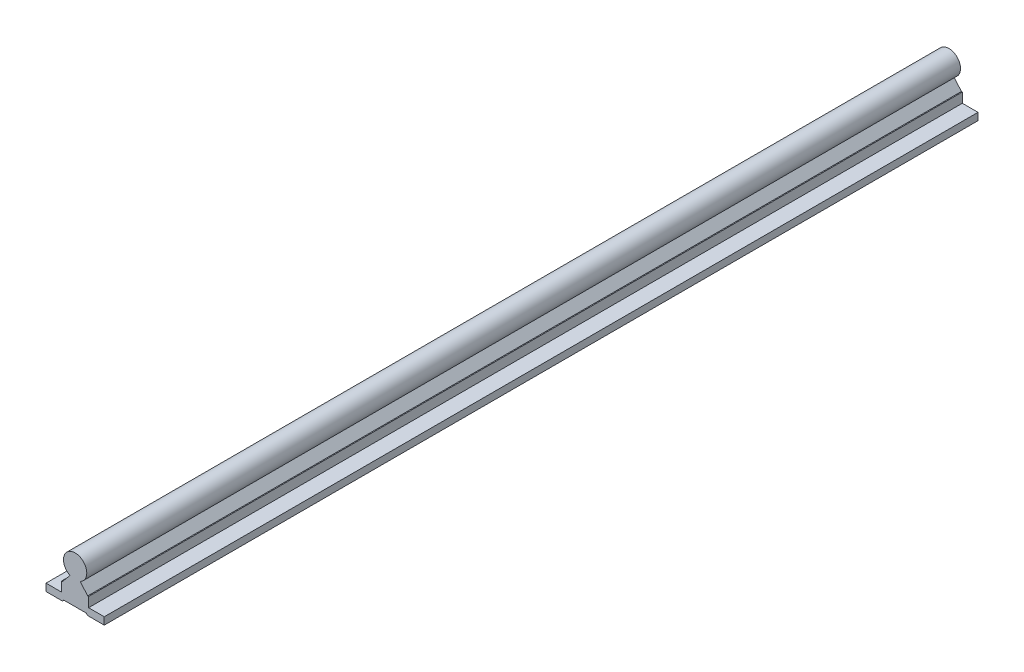
ISO-10303-21;
HEADER;
FILE_DESCRIPTION(('STEP AP214'),'2;1');
FILE_NAME('part.step','',(''),(''),'','','');
FILE_SCHEMA(('AUTOMOTIVE_DESIGN { 1 0 10303 214 1 1 1 1 }'));
ENDSEC;
DATA;
#1=APPLICATION_CONTEXT('core data for automotive mechanical design processes');
#2=APPLICATION_PROTOCOL_DEFINITION('international standard','automotive_design',2000,#1);
#3=PRODUCT_CONTEXT('',#1,'mechanical');
#4=PRODUCT('Part','Part','',(#3));
#5=PRODUCT_RELATED_PRODUCT_CATEGORY('part','',(#4));
#6=PRODUCT_DEFINITION_FORMATION('','',#4);
#7=PRODUCT_DEFINITION_CONTEXT('part definition',#1,'design');
#8=PRODUCT_DEFINITION('design','',#6,#7);
#9=PRODUCT_DEFINITION_SHAPE('','',#8);
#10=(LENGTH_UNIT() NAMED_UNIT(*) SI_UNIT(.MILLI.,.METRE.));
#11=(NAMED_UNIT(*) PLANE_ANGLE_UNIT() SI_UNIT($,.RADIAN.));
#12=(NAMED_UNIT(*) SI_UNIT($,.STERADIAN.) SOLID_ANGLE_UNIT());
#13=UNCERTAINTY_MEASURE_WITH_UNIT(LENGTH_MEASURE(1.E-05),#10,'distance_accuracy_value','');
#14=(GEOMETRIC_REPRESENTATION_CONTEXT(3) GLOBAL_UNCERTAINTY_ASSIGNED_CONTEXT((#13)) GLOBAL_UNIT_ASSIGNED_CONTEXT((#10,
#11,#12)) REPRESENTATION_CONTEXT('',''));
#15=CARTESIAN_POINT('',(0.,0.,0.));
#16=DIRECTION('',(0.,0.,1.));
#17=DIRECTION('',(1.,0.,0.));
#18=AXIS2_PLACEMENT_3D('',#15,#16,#17);
#19=CARTESIAN_POINT('',(0.,25.,600.));
#20=DIRECTION('',(0.,0.,-1.));
#21=DIRECTION('',(-1.,0.,0.));
#22=AXIS2_PLACEMENT_3D('',#19,#20,#21);
#23=CYLINDRICAL_SURFACE('',#22,8.);
#24=CARTESIAN_POINT('',(0.,25.,0.));
#25=DIRECTION('',(0.,0.,1.));
#26=DIRECTION('',(1.,0.,0.));
#27=AXIS2_PLACEMENT_3D('',#24,#25,#26);
#28=CIRCLE('',#27,8.);
#29=CARTESIAN_POINT('',(3.48711915483254,17.8,0.));
#30=VERTEX_POINT('',#29);
#31=CARTESIAN_POINT('',(-3.48711915483254,17.8,0.));
#32=VERTEX_POINT('',#31);
#33=EDGE_CURVE('E178',#30,#32,#28,.T.);
#34=ORIENTED_EDGE('',*,*,#33,.T.);
#35=DIRECTION('',(0.,0.,-1.));
#36=VECTOR('',#35,1.);
#37=CARTESIAN_POINT('',(-3.48711915483254,17.8,600.));
#38=LINE('',#37,#36);
#39=CARTESIAN_POINT('',(-3.48711915483254,17.8,600.));
#40=VERTEX_POINT('',#39);
#41=EDGE_CURVE('E11',#40,#32,#38,.T.);
#42=ORIENTED_EDGE('',*,*,#41,.F.);
#43=CARTESIAN_POINT('',(0.,25.,600.));
#44=DIRECTION('',(0.,0.,1.));
#45=DIRECTION('',(1.,0.,0.));
#46=AXIS2_PLACEMENT_3D('',#43,#44,#45);
#47=CIRCLE('',#46,8.);
#48=CARTESIAN_POINT('',(3.48711915483254,17.8,600.));
#49=VERTEX_POINT('',#48);
#50=EDGE_CURVE('E208',#49,#40,#47,.T.);
#51=ORIENTED_EDGE('',*,*,#50,.F.);
#52=DIRECTION('',(0.,0.,-1.));
#53=VECTOR('',#52,1.);
#54=CARTESIAN_POINT('',(3.48711915483254,17.8,600.));
#55=LINE('',#54,#53);
#56=EDGE_CURVE('E174',#49,#30,#55,.T.);
#57=ORIENTED_EDGE('',*,*,#56,.T.);
#58=EDGE_LOOP('',(#34,#42,#51,#57));
#59=FACE_BOUND('',#58,.T.);
#60=ADVANCED_FACE('F34',(#59),#23,.T.);
#61=CARTESIAN_POINT('',(-3.48711915483254,17.8,600.));
#62=DIRECTION('',(0.766044443118977,-0.64278760968654,0.));
#63=DIRECTION('',(0.642787609686541,0.766044443118977,0.));
#64=AXIS2_PLACEMENT_3D('',#61,#62,#63);
#65=PLANE('',#64);
#66=DIRECTION('',(-0.64278760968654,-0.766044443118977,0.));
#67=VECTOR('',#66,1.);
#68=CARTESIAN_POINT('',(-3.48711915483254,17.8,0.));
#69=LINE('',#68,#67);
#70=CARTESIAN_POINT('',(-8.60562690501396,11.7,0.));
#71=VERTEX_POINT('',#70);
#72=EDGE_CURVE('E181',#32,#71,#69,.T.);
#73=ORIENTED_EDGE('',*,*,#72,.T.);
#74=DIRECTION('',(0.,0.,-1.));
#75=VECTOR('',#74,1.);
#76=CARTESIAN_POINT('',(-8.60562690501396,11.7,600.));
#77=LINE('',#76,#75);
#78=CARTESIAN_POINT('',(-8.60562690501396,11.7,600.));
#79=VERTEX_POINT('',#78);
#80=EDGE_CURVE('E42',#79,#71,#77,.T.);
#81=ORIENTED_EDGE('',*,*,#80,.F.);
#82=DIRECTION('',(-0.64278760968654,-0.766044443118977,0.));
#83=VECTOR('',#82,1.);
#84=CARTESIAN_POINT('',(-3.48711915483254,17.8,600.));
#85=LINE('',#84,#83);
#86=EDGE_CURVE('E117',#40,#79,#85,.T.);
#87=ORIENTED_EDGE('',*,*,#86,.F.);
#88=ORIENTED_EDGE('',*,*,#41,.T.);
#89=EDGE_LOOP('',(#73,#81,#87,#88));
#90=FACE_BOUND('',#89,.T.);
#91=ADVANCED_FACE('F306',(#90),#65,.F.);
#92=CARTESIAN_POINT('',(-8.60562690501396,11.7,600.));
#93=DIRECTION('',(0.,-1.,0.));
#94=DIRECTION('',(0.,0.,-1.));
#95=AXIS2_PLACEMENT_3D('',#92,#93,#94);
#96=PLANE('',#95);
#97=DIRECTION('',(-1.,0.,0.));
#98=VECTOR('',#97,1.);
#99=CARTESIAN_POINT('',(-8.60562690501396,11.7,0.));
#100=LINE('',#99,#98);
#101=CARTESIAN_POINT('',(-9.25,11.7,0.));
#102=VERTEX_POINT('',#101);
#103=EDGE_CURVE('E183',#71,#102,#100,.T.);
#104=ORIENTED_EDGE('',*,*,#103,.T.);
#105=DIRECTION('',(0.,0.,-1.));
#106=VECTOR('',#105,1.);
#107=CARTESIAN_POINT('',(-9.25,11.7,600.));
#108=LINE('',#107,#106);
#109=CARTESIAN_POINT('',(-9.25,11.7,600.));
#110=VERTEX_POINT('',#109);
#111=EDGE_CURVE('E239',#110,#102,#108,.T.);
#112=ORIENTED_EDGE('',*,*,#111,.F.);
#113=DIRECTION('',(-1.,0.,0.));
#114=VECTOR('',#113,1.);
#115=CARTESIAN_POINT('',(-8.60562690501396,11.7,600.));
#116=LINE('',#115,#114);
#117=EDGE_CURVE('E247',#79,#110,#116,.T.);
#118=ORIENTED_EDGE('',*,*,#117,.F.);
#119=ORIENTED_EDGE('',*,*,#80,.T.);
#120=EDGE_LOOP('',(#104,#112,#118,#119));
#121=FACE_BOUND('',#120,.T.);
#122=ADVANCED_FACE('F245',(#121),#96,.F.);
#123=CARTESIAN_POINT('',(-9.25,11.7,600.));
#124=DIRECTION('',(1.,0.,0.));
#125=DIRECTION('',(0.,0.,-1.));
#126=AXIS2_PLACEMENT_3D('',#123,#124,#125);
#127=PLANE('',#126);
#128=DIRECTION('',(0.,-1.,0.));
#129=VECTOR('',#128,1.);
#130=CARTESIAN_POINT('',(-9.25,11.7,0.));
#131=LINE('',#130,#129);
#132=CARTESIAN_POINT('',(-9.25,5.,0.));
#133=VERTEX_POINT('',#132);
#134=EDGE_CURVE('E185',#102,#133,#131,.T.);
#135=ORIENTED_EDGE('',*,*,#134,.T.);
#136=DIRECTION('',(0.,0.,-1.));
#137=VECTOR('',#136,1.);
#138=CARTESIAN_POINT('',(-9.25,5.,600.));
#139=LINE('',#138,#137);
#140=CARTESIAN_POINT('',(-9.25,5.,600.));
#141=VERTEX_POINT('',#140);
#142=EDGE_CURVE('E236',#141,#133,#139,.T.);
#143=ORIENTED_EDGE('',*,*,#142,.F.);
#144=DIRECTION('',(0.,-1.,0.));
#145=VECTOR('',#144,1.);
#146=CARTESIAN_POINT('',(-9.25,11.7,600.));
#147=LINE('',#146,#145);
#148=EDGE_CURVE('E265',#110,#141,#147,.T.);
#149=ORIENTED_EDGE('',*,*,#148,.F.);
#150=ORIENTED_EDGE('',*,*,#111,.T.);
#151=EDGE_LOOP('',(#135,#143,#149,#150));
#152=FACE_BOUND('',#151,.T.);
#153=ADVANCED_FACE('F256',(#152),#127,.F.);
#154=CARTESIAN_POINT('',(-9.25,5.,600.));
#155=DIRECTION('',(0.,-1.,0.));
#156=DIRECTION('',(1.,0.,0.));
#157=AXIS2_PLACEMENT_3D('',#154,#155,#156);
#158=PLANE('',#157);
#159=DIRECTION('',(-1.,0.,0.));
#160=VECTOR('',#159,1.);
#161=CARTESIAN_POINT('',(-9.25,5.,0.));
#162=LINE('',#161,#160);
#163=CARTESIAN_POINT('',(-20.,5.,0.));
#164=VERTEX_POINT('',#163);
#165=EDGE_CURVE('E187',#133,#164,#162,.T.);
#166=ORIENTED_EDGE('',*,*,#165,.T.);
#167=DIRECTION('',(0.,0.,-1.));
#168=VECTOR('',#167,1.);
#169=CARTESIAN_POINT('',(-20.,5.,600.));
#170=LINE('',#169,#168);
#171=CARTESIAN_POINT('',(-20.,5.,600.));
#172=VERTEX_POINT('',#171);
#173=EDGE_CURVE('E233',#172,#164,#170,.T.);
#174=ORIENTED_EDGE('',*,*,#173,.F.);
#175=DIRECTION('',(-1.,0.,0.));
#176=VECTOR('',#175,1.);
#177=CARTESIAN_POINT('',(-9.25,5.,600.));
#178=LINE('',#177,#176);
#179=EDGE_CURVE('E262',#141,#172,#178,.T.);
#180=ORIENTED_EDGE('',*,*,#179,.F.);
#181=ORIENTED_EDGE('',*,*,#142,.T.);
#182=EDGE_LOOP('',(#166,#174,#180,#181));
#183=FACE_BOUND('',#182,.T.);
#184=ADVANCED_FACE('F260',(#183),#158,.F.);
#185=CARTESIAN_POINT('',(-20.,5.,600.));
#186=DIRECTION('',(1.,0.,0.));
#187=DIRECTION('',(0.,1.,0.));
#188=AXIS2_PLACEMENT_3D('',#185,#186,#187);
#189=PLANE('',#188);
#190=DIRECTION('',(0.,-1.,0.));
#191=VECTOR('',#190,1.);
#192=CARTESIAN_POINT('',(-20.,5.,0.));
#193=LINE('',#192,#191);
#194=CARTESIAN_POINT('',(-20.,0.,0.));
#195=VERTEX_POINT('',#194);
#196=EDGE_CURVE('E189',#164,#195,#193,.T.);
#197=ORIENTED_EDGE('',*,*,#196,.T.);
#198=DIRECTION('',(0.,0.,-1.));
#199=VECTOR('',#198,1.);
#200=CARTESIAN_POINT('',(-20.,0.,600.));
#201=LINE('',#200,#199);
#202=CARTESIAN_POINT('',(-20.,0.,600.));
#203=VERTEX_POINT('',#202);
#204=EDGE_CURVE('E230',#203,#195,#201,.T.);
#205=ORIENTED_EDGE('',*,*,#204,.F.);
#206=DIRECTION('',(0.,-1.,0.));
#207=VECTOR('',#206,1.);
#208=CARTESIAN_POINT('',(-20.,5.,600.));
#209=LINE('',#208,#207);
#210=EDGE_CURVE('E264',#172,#203,#209,.T.);
#211=ORIENTED_EDGE('',*,*,#210,.F.);
#212=ORIENTED_EDGE('',*,*,#173,.T.);
#213=EDGE_LOOP('',(#197,#205,#211,#212));
#214=FACE_BOUND('',#213,.T.);
#215=ADVANCED_FACE('F319',(#214),#189,.F.);
#216=CARTESIAN_POINT('',(-20.,0.,600.));
#217=DIRECTION('',(0.,1.,0.));
#218=DIRECTION('',(-1.,0.,0.));
#219=AXIS2_PLACEMENT_3D('',#216,#217,#218);
#220=PLANE('',#219);
#221=DIRECTION('',(1.,0.,0.));
#222=VECTOR('',#221,1.);
#223=CARTESIAN_POINT('',(-20.,0.,0.));
#224=LINE('',#223,#222);
#225=CARTESIAN_POINT('',(-8.60562690501397,0.,0.));
#226=VERTEX_POINT('',#225);
#227=EDGE_CURVE('E191',#195,#226,#224,.T.);
#228=ORIENTED_EDGE('',*,*,#227,.T.);
#229=DIRECTION('',(0.,0.,-1.));
#230=VECTOR('',#229,1.);
#231=CARTESIAN_POINT('',(-8.60562690501397,0.,600.));
#232=LINE('',#231,#230);
#233=CARTESIAN_POINT('',(-8.60562690501397,0.,600.));
#234=VERTEX_POINT('',#233);
#235=EDGE_CURVE('E227',#234,#226,#232,.T.);
#236=ORIENTED_EDGE('',*,*,#235,.F.);
#237=DIRECTION('',(1.,0.,0.));
#238=VECTOR('',#237,1.);
#239=CARTESIAN_POINT('',(-20.,0.,600.));
#240=LINE('',#239,#238);
#241=EDGE_CURVE('E267',#203,#234,#240,.T.);
#242=ORIENTED_EDGE('',*,*,#241,.F.);
#243=ORIENTED_EDGE('',*,*,#204,.T.);
#244=EDGE_LOOP('',(#228,#236,#242,#243));
#245=FACE_BOUND('',#244,.T.);
#246=ADVANCED_FACE('F322',(#245),#220,.F.);
#247=CARTESIAN_POINT('',(-8.60562690501397,0.,600.));
#248=DIRECTION('',(-0.766044443118977,0.642787609686541,0.));
#249=DIRECTION('',(-0.642787609686541,-0.766044443118977,0.));
#250=AXIS2_PLACEMENT_3D('',#247,#248,#249);
#251=PLANE('',#250);
#252=DIRECTION('',(0.642787609686541,0.766044443118977,0.));
#253=VECTOR('',#252,1.);
#254=CARTESIAN_POINT('',(-8.60562690501397,0.,0.));
#255=LINE('',#254,#253);
#256=CARTESIAN_POINT('',(-7.76652727383668,1.00000000000001,0.));
#257=VERTEX_POINT('',#256);
#258=EDGE_CURVE('E193',#226,#257,#255,.T.);
#259=ORIENTED_EDGE('',*,*,#258,.T.);
#260=DIRECTION('',(0.,0.,-1.));
#261=VECTOR('',#260,1.);
#262=CARTESIAN_POINT('',(-7.76652727383668,1.00000000000001,600.));
#263=LINE('',#262,#261);
#264=CARTESIAN_POINT('',(-7.76652727383668,1.00000000000001,600.));
#265=VERTEX_POINT('',#264);
#266=EDGE_CURVE('E224',#265,#257,#263,.T.);
#267=ORIENTED_EDGE('',*,*,#266,.F.);
#268=DIRECTION('',(0.642787609686541,0.766044443118977,0.));
#269=VECTOR('',#268,1.);
#270=CARTESIAN_POINT('',(-8.60562690501397,0.,600.));
#271=LINE('',#270,#269);
#272=EDGE_CURVE('E273',#234,#265,#271,.T.);
#273=ORIENTED_EDGE('',*,*,#272,.F.);
#274=ORIENTED_EDGE('',*,*,#235,.T.);
#275=EDGE_LOOP('',(#259,#267,#273,#274));
#276=FACE_BOUND('',#275,.T.);
#277=ADVANCED_FACE('F326',(#276),#251,.F.);
#278=CARTESIAN_POINT('',(-7.76652727383668,1.00000000000001,600.));
#279=DIRECTION('',(0.,1.,0.));
#280=DIRECTION('',(0.,0.,1.));
#281=AXIS2_PLACEMENT_3D('',#278,#279,#280);
#282=PLANE('',#281);
#283=DIRECTION('',(1.,0.,0.));
#284=VECTOR('',#283,1.);
#285=CARTESIAN_POINT('',(-7.76652727383668,1.00000000000001,0.));
#286=LINE('',#285,#284);
#287=CARTESIAN_POINT('',(7.76652727383668,1.00000000000001,0.));
#288=VERTEX_POINT('',#287);
#289=EDGE_CURVE('E195',#257,#288,#286,.T.);
#290=ORIENTED_EDGE('',*,*,#289,.T.);
#291=DIRECTION('',(0.,0.,-1.));
#292=VECTOR('',#291,1.);
#293=CARTESIAN_POINT('',(7.76652727383668,1.00000000000001,600.));
#294=LINE('',#293,#292);
#295=CARTESIAN_POINT('',(7.76652727383668,1.00000000000001,600.));
#296=VERTEX_POINT('',#295);
#297=EDGE_CURVE('E221',#296,#288,#294,.T.);
#298=ORIENTED_EDGE('',*,*,#297,.F.);
#299=DIRECTION('',(1.,0.,0.));
#300=VECTOR('',#299,1.);
#301=CARTESIAN_POINT('',(-7.76652727383668,1.00000000000001,600.));
#302=LINE('',#301,#300);
#303=EDGE_CURVE('E275',#265,#296,#302,.T.);
#304=ORIENTED_EDGE('',*,*,#303,.F.);
#305=ORIENTED_EDGE('',*,*,#266,.T.);
#306=EDGE_LOOP('',(#290,#298,#304,#305));
#307=FACE_BOUND('',#306,.T.);
#308=ADVANCED_FACE('F330',(#307),#282,.F.);
#309=CARTESIAN_POINT('',(8.60562690501397,0.,600.));
#310=DIRECTION('',(0.766044443118977,0.642787609686541,0.));
#311=DIRECTION('',(-0.642787609686541,0.766044443118977,0.));
#312=AXIS2_PLACEMENT_3D('',#309,#310,#311);
#313=PLANE('',#312);
#314=DIRECTION('',(0.642787609686541,-0.766044443118977,0.));
#315=VECTOR('',#314,1.);
#316=CARTESIAN_POINT('',(8.60562690501397,0.,0.));
#317=LINE('',#316,#315);
#318=CARTESIAN_POINT('',(8.60562690501397,0.,0.));
#319=VERTEX_POINT('',#318);
#320=EDGE_CURVE('E197',#288,#319,#317,.T.);
#321=ORIENTED_EDGE('',*,*,#320,.T.);
#322=DIRECTION('',(0.,0.,-1.));
#323=VECTOR('',#322,1.);
#324=CARTESIAN_POINT('',(8.60562690501397,0.,600.));
#325=LINE('',#324,#323);
#326=CARTESIAN_POINT('',(8.60562690501397,0.,600.));
#327=VERTEX_POINT('',#326);
#328=EDGE_CURVE('E218',#327,#319,#325,.T.);
#329=ORIENTED_EDGE('',*,*,#328,.F.);
#330=DIRECTION('',(0.642787609686541,-0.766044443118977,0.));
#331=VECTOR('',#330,1.);
#332=CARTESIAN_POINT('',(8.60562690501397,0.,600.));
#333=LINE('',#332,#331);
#334=EDGE_CURVE('E277',#296,#327,#333,.T.);
#335=ORIENTED_EDGE('',*,*,#334,.F.);
#336=ORIENTED_EDGE('',*,*,#297,.T.);
#337=EDGE_LOOP('',(#321,#329,#335,#336));
#338=FACE_BOUND('',#337,.T.);
#339=ADVANCED_FACE('F334',(#338),#313,.F.);
#340=CARTESIAN_POINT('',(20.,0.,600.));
#341=DIRECTION('',(0.,1.,0.));
#342=DIRECTION('',(-1.,0.,0.));
#343=AXIS2_PLACEMENT_3D('',#340,#341,#342);
#344=PLANE('',#343);
#345=DIRECTION('',(1.,0.,0.));
#346=VECTOR('',#345,1.);
#347=CARTESIAN_POINT('',(20.,0.,0.));
#348=LINE('',#347,#346);
#349=CARTESIAN_POINT('',(20.,0.,0.));
#350=VERTEX_POINT('',#349);
#351=EDGE_CURVE('E199',#319,#350,#348,.T.);
#352=ORIENTED_EDGE('',*,*,#351,.T.);
#353=DIRECTION('',(0.,0.,-1.));
#354=VECTOR('',#353,1.);
#355=CARTESIAN_POINT('',(20.,0.,600.));
#356=LINE('',#355,#354);
#357=CARTESIAN_POINT('',(20.,0.,600.));
#358=VERTEX_POINT('',#357);
#359=EDGE_CURVE('E215',#358,#350,#356,.T.);
#360=ORIENTED_EDGE('',*,*,#359,.F.);
#361=DIRECTION('',(1.,0.,0.));
#362=VECTOR('',#361,1.);
#363=CARTESIAN_POINT('',(20.,0.,600.));
#364=LINE('',#363,#362);
#365=EDGE_CURVE('E279',#327,#358,#364,.T.);
#366=ORIENTED_EDGE('',*,*,#365,.F.);
#367=ORIENTED_EDGE('',*,*,#328,.T.);
#368=EDGE_LOOP('',(#352,#360,#366,#367));
#369=FACE_BOUND('',#368,.T.);
#370=ADVANCED_FACE('F338',(#369),#344,.F.);
#371=CARTESIAN_POINT('',(20.,5.,600.));
#372=DIRECTION('',(-1.,0.,0.));
#373=DIRECTION('',(0.,-1.,0.));
#374=AXIS2_PLACEMENT_3D('',#371,#372,#373);
#375=PLANE('',#374);
#376=DIRECTION('',(0.,1.,0.));
#377=VECTOR('',#376,1.);
#378=CARTESIAN_POINT('',(20.,5.,0.));
#379=LINE('',#378,#377);
#380=CARTESIAN_POINT('',(20.,5.,0.));
#381=VERTEX_POINT('',#380);
#382=EDGE_CURVE('E201',#350,#381,#379,.T.);
#383=ORIENTED_EDGE('',*,*,#382,.T.);
#384=DIRECTION('',(0.,0.,-1.));
#385=VECTOR('',#384,1.);
#386=CARTESIAN_POINT('',(20.,5.,600.));
#387=LINE('',#386,#385);
#388=CARTESIAN_POINT('',(20.,5.,600.));
#389=VERTEX_POINT('',#388);
#390=EDGE_CURVE('E212',#389,#381,#387,.T.);
#391=ORIENTED_EDGE('',*,*,#390,.F.);
#392=DIRECTION('',(0.,1.,0.));
#393=VECTOR('',#392,1.);
#394=CARTESIAN_POINT('',(20.,5.,600.));
#395=LINE('',#394,#393);
#396=EDGE_CURVE('E281',#358,#389,#395,.T.);
#397=ORIENTED_EDGE('',*,*,#396,.F.);
#398=ORIENTED_EDGE('',*,*,#359,.T.);
#399=EDGE_LOOP('',(#383,#391,#397,#398));
#400=FACE_BOUND('',#399,.T.);
#401=ADVANCED_FACE('F287',(#400),#375,.F.);
#402=CARTESIAN_POINT('',(9.25,5.,600.));
#403=DIRECTION('',(0.,-1.,0.));
#404=DIRECTION('',(1.,0.,0.));
#405=AXIS2_PLACEMENT_3D('',#402,#403,#404);
#406=PLANE('',#405);
#407=DIRECTION('',(-1.,0.,0.));
#408=VECTOR('',#407,1.);
#409=CARTESIAN_POINT('',(9.25,5.,0.));
#410=LINE('',#409,#408);
#411=CARTESIAN_POINT('',(9.25,5.,0.));
#412=VERTEX_POINT('',#411);
#413=EDGE_CURVE('E203',#381,#412,#410,.T.);
#414=ORIENTED_EDGE('',*,*,#413,.T.);
#415=DIRECTION('',(0.,0.,-1.));
#416=VECTOR('',#415,1.);
#417=CARTESIAN_POINT('',(9.25,5.,600.));
#418=LINE('',#417,#416);
#419=CARTESIAN_POINT('',(9.25,5.,600.));
#420=VERTEX_POINT('',#419);
#421=EDGE_CURVE('E169',#420,#412,#418,.T.);
#422=ORIENTED_EDGE('',*,*,#421,.F.);
#423=DIRECTION('',(-1.,0.,0.));
#424=VECTOR('',#423,1.);
#425=CARTESIAN_POINT('',(9.25,5.,600.));
#426=LINE('',#425,#424);
#427=EDGE_CURVE('E160',#389,#420,#426,.T.);
#428=ORIENTED_EDGE('',*,*,#427,.F.);
#429=ORIENTED_EDGE('',*,*,#390,.T.);
#430=EDGE_LOOP('',(#414,#422,#428,#429));
#431=FACE_BOUND('',#430,.T.);
#432=ADVANCED_FACE('F291',(#431),#406,.F.);
#433=CARTESIAN_POINT('',(9.25,11.7,600.));
#434=DIRECTION('',(-1.,0.,0.));
#435=DIRECTION('',(0.,0.,1.));
#436=AXIS2_PLACEMENT_3D('',#433,#434,#435);
#437=PLANE('',#436);
#438=DIRECTION('',(0.,1.,0.));
#439=VECTOR('',#438,1.);
#440=CARTESIAN_POINT('',(9.25,11.7,0.));
#441=LINE('',#440,#439);
#442=CARTESIAN_POINT('',(9.25,11.7,0.));
#443=VERTEX_POINT('',#442);
#444=EDGE_CURVE('E168',#412,#443,#441,.T.);
#445=ORIENTED_EDGE('',*,*,#444,.T.);
#446=DIRECTION('',(0.,0.,-1.));
#447=VECTOR('',#446,1.);
#448=CARTESIAN_POINT('',(9.25,11.7,600.));
#449=LINE('',#448,#447);
#450=CARTESIAN_POINT('',(9.25,11.7,600.));
#451=VERTEX_POINT('',#450);
#452=EDGE_CURVE('E165',#451,#443,#449,.T.);
#453=ORIENTED_EDGE('',*,*,#452,.F.);
#454=DIRECTION('',(0.,1.,0.));
#455=VECTOR('',#454,1.);
#456=CARTESIAN_POINT('',(9.25,11.7,600.));
#457=LINE('',#456,#455);
#458=EDGE_CURVE('E154',#420,#451,#457,.T.);
#459=ORIENTED_EDGE('',*,*,#458,.F.);
#460=ORIENTED_EDGE('',*,*,#421,.T.);
#461=EDGE_LOOP('',(#445,#453,#459,#460));
#462=FACE_BOUND('',#461,.T.);
#463=ADVANCED_FACE('F166',(#462),#437,.F.);
#464=CARTESIAN_POINT('',(8.60562690501396,11.7,600.));
#465=DIRECTION('',(0.,-1.,0.));
#466=DIRECTION('',(0.,0.,-1.));
#467=AXIS2_PLACEMENT_3D('',#464,#465,#466);
#468=PLANE('',#467);
#469=DIRECTION('',(-1.,0.,0.));
#470=VECTOR('',#469,1.);
#471=CARTESIAN_POINT('',(8.60562690501396,11.7,0.));
#472=LINE('',#471,#470);
#473=CARTESIAN_POINT('',(8.60562690501396,11.7,0.));
#474=VERTEX_POINT('',#473);
#475=EDGE_CURVE('E103',#443,#474,#472,.T.);
#476=ORIENTED_EDGE('',*,*,#475,.T.);
#477=DIRECTION('',(0.,0.,-1.));
#478=VECTOR('',#477,1.);
#479=CARTESIAN_POINT('',(8.60562690501396,11.7,600.));
#480=LINE('',#479,#478);
#481=CARTESIAN_POINT('',(8.60562690501396,11.7,600.));
#482=VERTEX_POINT('',#481);
#483=EDGE_CURVE('E170',#482,#474,#480,.T.);
#484=ORIENTED_EDGE('',*,*,#483,.F.);
#485=DIRECTION('',(-1.,0.,0.));
#486=VECTOR('',#485,1.);
#487=CARTESIAN_POINT('',(8.60562690501396,11.7,600.));
#488=LINE('',#487,#486);
#489=EDGE_CURVE('E158',#451,#482,#488,.T.);
#490=ORIENTED_EDGE('',*,*,#489,.F.);
#491=ORIENTED_EDGE('',*,*,#452,.T.);
#492=EDGE_LOOP('',(#476,#484,#490,#491));
#493=FACE_BOUND('',#492,.T.);
#494=ADVANCED_FACE('F172',(#493),#468,.F.);
#495=CARTESIAN_POINT('',(3.48711915483254,17.8,600.));
#496=DIRECTION('',(-0.766044443118977,-0.64278760968654,0.));
#497=DIRECTION('',(0.642787609686541,-0.766044443118977,0.));
#498=AXIS2_PLACEMENT_3D('',#495,#496,#497);
#499=PLANE('',#498);
#500=DIRECTION('',(-0.64278760968654,0.766044443118977,0.));
#501=VECTOR('',#500,1.);
#502=CARTESIAN_POINT('',(3.48711915483254,17.8,0.));
#503=LINE('',#502,#501);
#504=EDGE_CURVE('E109',#474,#30,#503,.T.);
#505=ORIENTED_EDGE('',*,*,#504,.T.);
#506=ORIENTED_EDGE('',*,*,#56,.F.);
#507=DIRECTION('',(-0.64278760968654,0.766044443118977,0.));
#508=VECTOR('',#507,1.);
#509=CARTESIAN_POINT('',(3.48711915483254,17.8,600.));
#510=LINE('',#509,#508);
#511=EDGE_CURVE('E50',#482,#49,#510,.T.);
#512=ORIENTED_EDGE('',*,*,#511,.F.);
#513=ORIENTED_EDGE('',*,*,#483,.T.);
#514=EDGE_LOOP('',(#505,#506,#512,#513));
#515=FACE_BOUND('',#514,.T.);
#516=ADVANCED_FACE('F295',(#515),#499,.F.);
#517=CARTESIAN_POINT('',(0.,25.,600.));
#518=DIRECTION('',(0.,0.,1.));
#519=DIRECTION('',(1.,0.,0.));
#520=AXIS2_PLACEMENT_3D('',#517,#518,#519);
#521=PLANE('',#520);
#522=ORIENTED_EDGE('',*,*,#50,.T.);
#523=ORIENTED_EDGE('',*,*,#86,.T.);
#524=ORIENTED_EDGE('',*,*,#117,.T.);
#525=ORIENTED_EDGE('',*,*,#148,.T.);
#526=ORIENTED_EDGE('',*,*,#179,.T.);
#527=ORIENTED_EDGE('',*,*,#210,.T.);
#528=ORIENTED_EDGE('',*,*,#241,.T.);
#529=ORIENTED_EDGE('',*,*,#272,.T.);
#530=ORIENTED_EDGE('',*,*,#303,.T.);
#531=ORIENTED_EDGE('',*,*,#334,.T.);
#532=ORIENTED_EDGE('',*,*,#365,.T.);
#533=ORIENTED_EDGE('',*,*,#396,.T.);
#534=ORIENTED_EDGE('',*,*,#427,.T.);
#535=ORIENTED_EDGE('',*,*,#458,.T.);
#536=ORIENTED_EDGE('',*,*,#489,.T.);
#537=ORIENTED_EDGE('',*,*,#511,.T.);
#538=EDGE_LOOP('',(#522,#523,#524,#525,#526,#527,#528,#529,#530,#531,#532,#533,#534,#535,#536,#537));
#539=FACE_BOUND('',#538,.T.);
#540=ADVANCED_FACE('F156',(#539),#521,.T.);
#541=CARTESIAN_POINT('',(0.,25.,0.));
#542=DIRECTION('',(0.,0.,1.));
#543=DIRECTION('',(1.,0.,0.));
#544=AXIS2_PLACEMENT_3D('',#541,#542,#543);
#545=PLANE('',#544);
#546=ORIENTED_EDGE('',*,*,#33,.F.);
#547=ORIENTED_EDGE('',*,*,#504,.F.);
#548=ORIENTED_EDGE('',*,*,#475,.F.);
#549=ORIENTED_EDGE('',*,*,#444,.F.);
#550=ORIENTED_EDGE('',*,*,#413,.F.);
#551=ORIENTED_EDGE('',*,*,#382,.F.);
#552=ORIENTED_EDGE('',*,*,#351,.F.);
#553=ORIENTED_EDGE('',*,*,#320,.F.);
#554=ORIENTED_EDGE('',*,*,#289,.F.);
#555=ORIENTED_EDGE('',*,*,#258,.F.);
#556=ORIENTED_EDGE('',*,*,#227,.F.);
#557=ORIENTED_EDGE('',*,*,#196,.F.);
#558=ORIENTED_EDGE('',*,*,#165,.F.);
#559=ORIENTED_EDGE('',*,*,#134,.F.);
#560=ORIENTED_EDGE('',*,*,#103,.F.);
#561=ORIENTED_EDGE('',*,*,#72,.F.);
#562=EDGE_LOOP('',(#546,#547,#548,#549,#550,#551,#552,#553,#554,#555,#556,#557,#558,#559,#560,#561));
#563=FACE_BOUND('',#562,.T.);
#564=ADVANCED_FACE('F251',(#563),#545,.F.);
#565=CLOSED_SHELL('',(#60,#91,#122,#153,#184,#215,#246,#277,#308,#339,#370,#401,#432,#463,#494,
#516,#540,#564));
#566=MANIFOLD_SOLID_BREP('B2',#565);
#567=ADVANCED_BREP_SHAPE_REPRESENTATION('',(#18,#566),#14);
#568=SHAPE_DEFINITION_REPRESENTATION(#9,#567);
ENDSEC;
END-ISO-10303-21;
